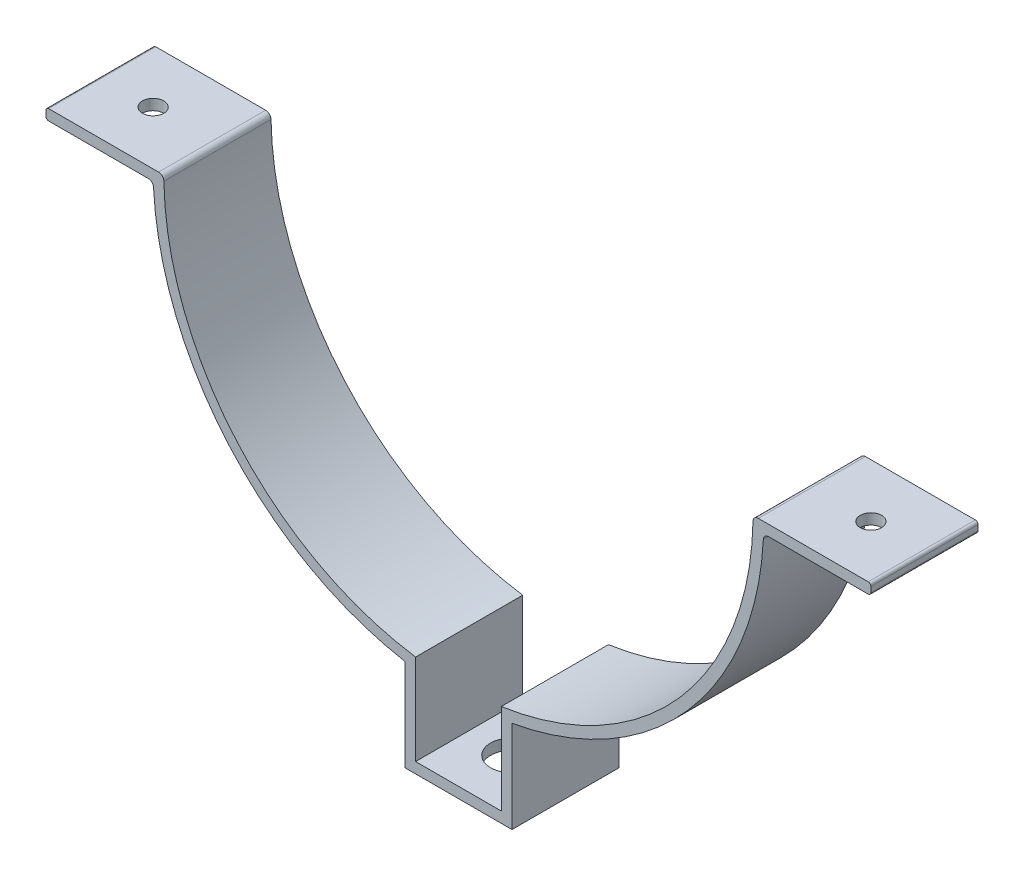
ISO-10303-21;
HEADER;
FILE_DESCRIPTION(('STEP AP214'),'2;1');
FILE_NAME('part.step','',(''),(''),'','','');
FILE_SCHEMA(('AUTOMOTIVE_DESIGN { 1 0 10303 214 1 1 1 1 }'));
ENDSEC;
DATA;
#1=APPLICATION_CONTEXT('core data for automotive mechanical design processes');
#2=APPLICATION_PROTOCOL_DEFINITION('international standard','automotive_design',2000,#1);
#3=PRODUCT_CONTEXT('',#1,'mechanical');
#4=PRODUCT('Part','Part','',(#3));
#5=PRODUCT_RELATED_PRODUCT_CATEGORY('part','',(#4));
#6=PRODUCT_DEFINITION_FORMATION('','',#4);
#7=PRODUCT_DEFINITION_CONTEXT('part definition',#1,'design');
#8=PRODUCT_DEFINITION('design','',#6,#7);
#9=PRODUCT_DEFINITION_SHAPE('','',#8);
#10=(LENGTH_UNIT() NAMED_UNIT(*) SI_UNIT(.MILLI.,.METRE.));
#11=(NAMED_UNIT(*) PLANE_ANGLE_UNIT() SI_UNIT($,.RADIAN.));
#12=(NAMED_UNIT(*) SI_UNIT($,.STERADIAN.) SOLID_ANGLE_UNIT());
#13=UNCERTAINTY_MEASURE_WITH_UNIT(LENGTH_MEASURE(1.E-05),#10,'distance_accuracy_value','');
#14=(GEOMETRIC_REPRESENTATION_CONTEXT(3) GLOBAL_UNCERTAINTY_ASSIGNED_CONTEXT((#13)) GLOBAL_UNIT_ASSIGNED_CONTEXT((#10,
#11,#12)) REPRESENTATION_CONTEXT('',''));
#15=CARTESIAN_POINT('',(0.,0.,0.));
#16=DIRECTION('',(0.,0.,1.));
#17=DIRECTION('',(1.,0.,0.));
#18=AXIS2_PLACEMENT_3D('',#15,#16,#17);
#19=CARTESIAN_POINT('',(-57.9223618302983,-3.,20.));
#20=DIRECTION('',(0.,0.,-1.));
#21=DIRECTION('',(-1.,0.,0.));
#22=AXIS2_PLACEMENT_3D('',#19,#20,#21);
#23=CYLINDRICAL_SURFACE('',#22,1.);
#24=CARTESIAN_POINT('',(-57.9223618302983,-3.,0.));
#25=DIRECTION('',(0.,0.,-1.));
#26=DIRECTION('',(1.,0.,0.));
#27=AXIS2_PLACEMENT_3D('',#24,#25,#26);
#28=CIRCLE('',#27,1.);
#29=CARTESIAN_POINT('',(-57.9223618302983,-2.,0.));
#30=VERTEX_POINT('',#29);
#31=CARTESIAN_POINT('',(-56.9237004194311,-2.94827586206897,0.));
#32=VERTEX_POINT('',#31);
#33=EDGE_CURVE('E227',#30,#32,#28,.T.);
#34=ORIENTED_EDGE('',*,*,#33,.T.);
#35=DIRECTION('',(0.,0.,-1.));
#36=VECTOR('',#35,1.);
#37=CARTESIAN_POINT('',(-56.9237004194311,-2.94827586206897,20.));
#38=LINE('',#37,#36);
#39=CARTESIAN_POINT('',(-56.9237004194311,-2.94827586206897,20.));
#40=VERTEX_POINT('',#39);
#41=EDGE_CURVE('E11',#40,#32,#38,.T.);
#42=ORIENTED_EDGE('',*,*,#41,.F.);
#43=CARTESIAN_POINT('',(-57.9223618302983,-3.,20.));
#44=DIRECTION('',(0.,0.,-1.));
#45=DIRECTION('',(1.,0.,0.));
#46=AXIS2_PLACEMENT_3D('',#43,#44,#45);
#47=CIRCLE('',#46,1.);
#48=CARTESIAN_POINT('',(-57.9223618302983,-2.,20.));
#49=VERTEX_POINT('',#48);
#50=EDGE_CURVE('E278',#49,#40,#47,.T.);
#51=ORIENTED_EDGE('',*,*,#50,.F.);
#52=DIRECTION('',(0.,0.,-1.));
#53=VECTOR('',#52,1.);
#54=CARTESIAN_POINT('',(-57.9223618302983,-2.,20.));
#55=LINE('',#54,#53);
#56=EDGE_CURVE('E223',#49,#30,#55,.T.);
#57=ORIENTED_EDGE('',*,*,#56,.T.);
#58=EDGE_LOOP('',(#34,#42,#51,#57));
#59=FACE_BOUND('',#58,.T.);
#60=ADVANCED_FACE('F33',(#59),#23,.F.);
#61=CARTESIAN_POINT('',(0.,0.,20.));
#62=DIRECTION('',(0.,0.,-1.));
#63=DIRECTION('',(-1.,0.,0.));
#64=AXIS2_PLACEMENT_3D('',#61,#62,#63);
#65=CYLINDRICAL_SURFACE('',#64,57.);
#66=CARTESIAN_POINT('',(0.,0.,0.));
#67=DIRECTION('',(0.,0.,1.));
#68=DIRECTION('',(1.,0.,0.));
#69=AXIS2_PLACEMENT_3D('',#66,#67,#68);
#70=CIRCLE('',#69,57.);
#71=CARTESIAN_POINT('',(-10.,-56.1159513863928,0.));
#72=VERTEX_POINT('',#71);
#73=EDGE_CURVE('E230',#32,#72,#70,.T.);
#74=ORIENTED_EDGE('',*,*,#73,.T.);
#75=DIRECTION('',(0.,0.,-1.));
#76=VECTOR('',#75,1.);
#77=CARTESIAN_POINT('',(-10.,-56.1159513863928,20.));
#78=LINE('',#77,#76);
#79=CARTESIAN_POINT('',(-10.,-56.1159513863928,20.));
#80=VERTEX_POINT('',#79);
#81=EDGE_CURVE('E42',#80,#72,#78,.T.);
#82=ORIENTED_EDGE('',*,*,#81,.F.);
#83=CARTESIAN_POINT('',(0.,0.,20.));
#84=DIRECTION('',(0.,0.,1.));
#85=DIRECTION('',(1.,0.,0.));
#86=AXIS2_PLACEMENT_3D('',#83,#84,#85);
#87=CIRCLE('',#86,57.);
#88=EDGE_CURVE('E142',#40,#80,#87,.T.);
#89=ORIENTED_EDGE('',*,*,#88,.F.);
#90=ORIENTED_EDGE('',*,*,#41,.T.);
#91=EDGE_LOOP('',(#74,#82,#89,#90));
#92=FACE_BOUND('',#91,.T.);
#93=ADVANCED_FACE('F422',(#92),#65,.T.);
#94=CARTESIAN_POINT('',(-10.,-73.3128558385895,20.));
#95=DIRECTION('',(1.,0.,0.));
#96=DIRECTION('',(0.,1.,0.));
#97=AXIS2_PLACEMENT_3D('',#94,#95,#96);
#98=PLANE('',#97);
#99=DIRECTION('',(0.,-1.,0.));
#100=VECTOR('',#99,1.);
#101=CARTESIAN_POINT('',(-10.,-73.3128558385895,0.));
#102=LINE('',#101,#100);
#103=CARTESIAN_POINT('',(-10.,-73.3128558385895,0.));
#104=VERTEX_POINT('',#103);
#105=EDGE_CURVE('E233',#72,#104,#102,.T.);
#106=ORIENTED_EDGE('',*,*,#105,.T.);
#107=DIRECTION('',(0.,0.,-1.));
#108=VECTOR('',#107,1.);
#109=CARTESIAN_POINT('',(-10.,-73.3128558385895,20.));
#110=LINE('',#109,#108);
#111=CARTESIAN_POINT('',(-10.,-73.3128558385895,20.));
#112=VERTEX_POINT('',#111);
#113=EDGE_CURVE('E333',#112,#104,#110,.T.);
#114=ORIENTED_EDGE('',*,*,#113,.F.);
#115=DIRECTION('',(0.,-1.,0.));
#116=VECTOR('',#115,1.);
#117=CARTESIAN_POINT('',(-10.,-73.3128558385895,20.));
#118=LINE('',#117,#116);
#119=EDGE_CURVE('E358',#80,#112,#118,.T.);
#120=ORIENTED_EDGE('',*,*,#119,.F.);
#121=ORIENTED_EDGE('',*,*,#81,.T.);
#122=EDGE_LOOP('',(#106,#114,#120,#121));
#123=FACE_BOUND('',#122,.T.);
#124=ADVANCED_FACE('F426',(#123),#98,.F.);
#125=CARTESIAN_POINT('',(-10.,-73.3128558385895,20.));
#126=DIRECTION('',(0.,1.,0.));
#127=DIRECTION('',(0.,0.,1.));
#128=AXIS2_PLACEMENT_3D('',#125,#126,#127);
#129=PLANE('',#128);
#130=CARTESIAN_POINT('',(0.,-73.3128558385895,10.));
#131=DIRECTION('',(0.,1.,0.));
#132=DIRECTION('',(0.,0.,1.));
#133=AXIS2_PLACEMENT_3D('',#130,#131,#132);
#134=CIRCLE('',#133,4.);
#135=CARTESIAN_POINT('',(0.,-73.3128558385895,14.));
#136=VERTEX_POINT('',#135);
#137=EDGE_CURVE('E231',#136,#136,#134,.T.);
#138=ORIENTED_EDGE('',*,*,#137,.T.);
#139=EDGE_LOOP('',(#138));
#140=FACE_BOUND('',#139,.T.);
#141=DIRECTION('',(1.,0.,0.));
#142=VECTOR('',#141,1.);
#143=CARTESIAN_POINT('',(-10.,-73.3128558385895,0.));
#144=LINE('',#143,#142);
#145=CARTESIAN_POINT('',(10.,-73.3128558385895,0.));
#146=VERTEX_POINT('',#145);
#147=EDGE_CURVE('E235',#104,#146,#144,.T.);
#148=ORIENTED_EDGE('',*,*,#147,.T.);
#149=DIRECTION('',(0.,0.,-1.));
#150=VECTOR('',#149,1.);
#151=CARTESIAN_POINT('',(10.,-73.3128558385895,20.));
#152=LINE('',#151,#150);
#153=CARTESIAN_POINT('',(10.,-73.3128558385895,20.));
#154=VERTEX_POINT('',#153);
#155=EDGE_CURVE('E330',#154,#146,#152,.T.);
#156=ORIENTED_EDGE('',*,*,#155,.F.);
#157=DIRECTION('',(1.,0.,0.));
#158=VECTOR('',#157,1.);
#159=CARTESIAN_POINT('',(-10.,-73.3128558385895,20.));
#160=LINE('',#159,#158);
#161=EDGE_CURVE('E360',#112,#154,#160,.T.);
#162=ORIENTED_EDGE('',*,*,#161,.F.);
#163=ORIENTED_EDGE('',*,*,#113,.T.);
#164=EDGE_LOOP('',(#148,#156,#162,#163));
#165=FACE_BOUND('',#164,.T.);
#166=ADVANCED_FACE('F430',(#140,#165),#129,.F.);
#167=CARTESIAN_POINT('',(10.,-73.3128558385895,20.));
#168=DIRECTION('',(-1.,0.,0.));
#169=DIRECTION('',(0.,-1.,0.));
#170=AXIS2_PLACEMENT_3D('',#167,#168,#169);
#171=PLANE('',#170);
#172=DIRECTION('',(0.,1.,0.));
#173=VECTOR('',#172,1.);
#174=CARTESIAN_POINT('',(10.,-73.3128558385895,0.));
#175=LINE('',#174,#173);
#176=CARTESIAN_POINT('',(10.,-56.1159513863928,0.));
#177=VERTEX_POINT('',#176);
#178=EDGE_CURVE('E237',#146,#177,#175,.T.);
#179=ORIENTED_EDGE('',*,*,#178,.T.);
#180=DIRECTION('',(0.,0.,-1.));
#181=VECTOR('',#180,1.);
#182=CARTESIAN_POINT('',(10.,-56.1159513863928,20.));
#183=LINE('',#182,#181);
#184=CARTESIAN_POINT('',(10.,-56.1159513863928,20.));
#185=VERTEX_POINT('',#184);
#186=EDGE_CURVE('E327',#185,#177,#183,.T.);
#187=ORIENTED_EDGE('',*,*,#186,.F.);
#188=DIRECTION('',(0.,1.,0.));
#189=VECTOR('',#188,1.);
#190=CARTESIAN_POINT('',(10.,-73.3128558385895,20.));
#191=LINE('',#190,#189);
#192=EDGE_CURVE('E362',#154,#185,#191,.T.);
#193=ORIENTED_EDGE('',*,*,#192,.F.);
#194=ORIENTED_EDGE('',*,*,#155,.T.);
#195=EDGE_LOOP('',(#179,#187,#193,#194));
#196=FACE_BOUND('',#195,.T.);
#197=ADVANCED_FACE('F436',(#196),#171,.F.);
#198=CARTESIAN_POINT('',(0.,0.,20.));
#199=DIRECTION('',(0.,0.,-1.));
#200=DIRECTION('',(-1.,0.,0.));
#201=AXIS2_PLACEMENT_3D('',#198,#199,#200);
#202=CYLINDRICAL_SURFACE('',#201,57.);
#203=CARTESIAN_POINT('',(0.,0.,0.));
#204=DIRECTION('',(0.,0.,1.));
#205=DIRECTION('',(1.,0.,0.));
#206=AXIS2_PLACEMENT_3D('',#203,#204,#205);
#207=CIRCLE('',#206,57.);
#208=CARTESIAN_POINT('',(56.9237004194311,-2.94827586206896,0.));
#209=VERTEX_POINT('',#208);
#210=EDGE_CURVE('E239',#177,#209,#207,.T.);
#211=ORIENTED_EDGE('',*,*,#210,.T.);
#212=DIRECTION('',(0.,0.,-1.));
#213=VECTOR('',#212,1.);
#214=CARTESIAN_POINT('',(56.9237004194311,-2.94827586206896,20.));
#215=LINE('',#214,#213);
#216=CARTESIAN_POINT('',(56.9237004194311,-2.94827586206896,20.));
#217=VERTEX_POINT('',#216);
#218=EDGE_CURVE('E324',#217,#209,#215,.T.);
#219=ORIENTED_EDGE('',*,*,#218,.F.);
#220=CARTESIAN_POINT('',(0.,0.,20.));
#221=DIRECTION('',(0.,0.,1.));
#222=DIRECTION('',(1.,0.,0.));
#223=AXIS2_PLACEMENT_3D('',#220,#221,#222);
#224=CIRCLE('',#223,57.);
#225=EDGE_CURVE('E364',#185,#217,#224,.T.);
#226=ORIENTED_EDGE('',*,*,#225,.F.);
#227=ORIENTED_EDGE('',*,*,#186,.T.);
#228=EDGE_LOOP('',(#211,#219,#226,#227));
#229=FACE_BOUND('',#228,.T.);
#230=ADVANCED_FACE('F440',(#229),#202,.T.);
#231=CARTESIAN_POINT('',(57.9223618302983,-3.,20.));
#232=DIRECTION('',(0.,0.,-1.));
#233=DIRECTION('',(-1.,0.,0.));
#234=AXIS2_PLACEMENT_3D('',#231,#232,#233);
#235=CYLINDRICAL_SURFACE('',#234,1.);
#236=CARTESIAN_POINT('',(57.9223618302983,-3.,0.));
#237=DIRECTION('',(0.,0.,-1.));
#238=DIRECTION('',(-1.,0.,0.));
#239=AXIS2_PLACEMENT_3D('',#236,#237,#238);
#240=CIRCLE('',#239,1.);
#241=CARTESIAN_POINT('',(57.9223618302983,-2.,0.));
#242=VERTEX_POINT('',#241);
#243=EDGE_CURVE('E241',#209,#242,#240,.T.);
#244=ORIENTED_EDGE('',*,*,#243,.T.);
#245=DIRECTION('',(0.,0.,-1.));
#246=VECTOR('',#245,1.);
#247=CARTESIAN_POINT('',(57.9223618302983,-2.,20.));
#248=LINE('',#247,#246);
#249=CARTESIAN_POINT('',(57.9223618302983,-2.,20.));
#250=VERTEX_POINT('',#249);
#251=EDGE_CURVE('E321',#250,#242,#248,.T.);
#252=ORIENTED_EDGE('',*,*,#251,.F.);
#253=CARTESIAN_POINT('',(57.9223618302983,-3.,20.));
#254=DIRECTION('',(0.,0.,-1.));
#255=DIRECTION('',(-1.,0.,0.));
#256=AXIS2_PLACEMENT_3D('',#253,#254,#255);
#257=CIRCLE('',#256,1.);
#258=EDGE_CURVE('E366',#217,#250,#257,.T.);
#259=ORIENTED_EDGE('',*,*,#258,.F.);
#260=ORIENTED_EDGE('',*,*,#218,.T.);
#261=EDGE_LOOP('',(#244,#252,#259,#260));
#262=FACE_BOUND('',#261,.T.);
#263=ADVANCED_FACE('F444',(#262),#235,.F.);
#264=CARTESIAN_POINT('',(76.5,-2.,20.));
#265=DIRECTION('',(0.,1.,0.));
#266=DIRECTION('',(0.,0.,1.));
#267=AXIS2_PLACEMENT_3D('',#264,#265,#266);
#268=PLANE('',#267);
#269=CARTESIAN_POINT('',(66.9999999999997,-2.,10.));
#270=DIRECTION('',(0.,1.,0.));
#271=DIRECTION('',(0.,0.,1.));
#272=AXIS2_PLACEMENT_3D('',#269,#270,#271);
#273=CIRCLE('',#272,2.);
#274=CARTESIAN_POINT('',(66.9999999999997,-2.,12.));
#275=VERTEX_POINT('',#274);
#276=EDGE_CURVE('E340',#275,#275,#273,.T.);
#277=ORIENTED_EDGE('',*,*,#276,.T.);
#278=EDGE_LOOP('',(#277));
#279=FACE_BOUND('',#278,.T.);
#280=DIRECTION('',(1.,0.,0.));
#281=VECTOR('',#280,1.);
#282=CARTESIAN_POINT('',(76.5,-2.,0.));
#283=LINE('',#282,#281);
#284=CARTESIAN_POINT('',(76.5,-2.,0.));
#285=VERTEX_POINT('',#284);
#286=EDGE_CURVE('E243',#242,#285,#283,.T.);
#287=ORIENTED_EDGE('',*,*,#286,.T.);
#288=DIRECTION('',(0.,0.,-1.));
#289=VECTOR('',#288,1.);
#290=CARTESIAN_POINT('',(76.5,-2.,20.));
#291=LINE('',#290,#289);
#292=CARTESIAN_POINT('',(76.5,-2.,20.));
#293=VERTEX_POINT('',#292);
#294=EDGE_CURVE('E318',#293,#285,#291,.T.);
#295=ORIENTED_EDGE('',*,*,#294,.F.);
#296=DIRECTION('',(1.,0.,0.));
#297=VECTOR('',#296,1.);
#298=CARTESIAN_POINT('',(76.5,-2.,20.));
#299=LINE('',#298,#297);
#300=EDGE_CURVE('E368',#250,#293,#299,.T.);
#301=ORIENTED_EDGE('',*,*,#300,.F.);
#302=ORIENTED_EDGE('',*,*,#251,.T.);
#303=EDGE_LOOP('',(#287,#295,#301,#302));
#304=FACE_BOUND('',#303,.T.);
#305=ADVANCED_FACE('F448',(#279,#304),#268,.F.);
#306=CARTESIAN_POINT('',(76.5,-1.5,20.));
#307=DIRECTION('',(0.,0.,-1.));
#308=DIRECTION('',(-1.,0.,0.));
#309=AXIS2_PLACEMENT_3D('',#306,#307,#308);
#310=CYLINDRICAL_SURFACE('',#309,0.5);
#311=CARTESIAN_POINT('',(76.5,-1.5,0.));
#312=DIRECTION('',(0.,0.,1.));
#313=DIRECTION('',(-1.,0.,0.));
#314=AXIS2_PLACEMENT_3D('',#311,#312,#313);
#315=CIRCLE('',#314,0.5);
#316=CARTESIAN_POINT('',(77.,-1.5,0.));
#317=VERTEX_POINT('',#316);
#318=EDGE_CURVE('E245',#285,#317,#315,.T.);
#319=ORIENTED_EDGE('',*,*,#318,.T.);
#320=DIRECTION('',(0.,0.,-1.));
#321=VECTOR('',#320,1.);
#322=CARTESIAN_POINT('',(77.,-1.5,20.));
#323=LINE('',#322,#321);
#324=CARTESIAN_POINT('',(77.,-1.5,20.));
#325=VERTEX_POINT('',#324);
#326=EDGE_CURVE('E315',#325,#317,#323,.T.);
#327=ORIENTED_EDGE('',*,*,#326,.F.);
#328=CARTESIAN_POINT('',(76.5,-1.5,20.));
#329=DIRECTION('',(0.,0.,1.));
#330=DIRECTION('',(-1.,0.,0.));
#331=AXIS2_PLACEMENT_3D('',#328,#329,#330);
#332=CIRCLE('',#331,0.5);
#333=EDGE_CURVE('E370',#293,#325,#332,.T.);
#334=ORIENTED_EDGE('',*,*,#333,.F.);
#335=ORIENTED_EDGE('',*,*,#294,.T.);
#336=EDGE_LOOP('',(#319,#327,#334,#335));
#337=FACE_BOUND('',#336,.T.);
#338=ADVANCED_FACE('F452',(#337),#310,.T.);
#339=CARTESIAN_POINT('',(77.,-0.500000000000018,20.));
#340=DIRECTION('',(-1.,0.,0.));
#341=DIRECTION('',(0.,-1.,0.));
#342=AXIS2_PLACEMENT_3D('',#339,#340,#341);
#343=PLANE('',#342);
#344=DIRECTION('',(0.,1.,0.));
#345=VECTOR('',#344,1.);
#346=CARTESIAN_POINT('',(77.,-0.500000000000018,0.));
#347=LINE('',#346,#345);
#348=CARTESIAN_POINT('',(77.,-0.500000000000018,0.));
#349=VERTEX_POINT('',#348);
#350=EDGE_CURVE('E247',#317,#349,#347,.T.);
#351=ORIENTED_EDGE('',*,*,#350,.T.);
#352=DIRECTION('',(0.,0.,-1.));
#353=VECTOR('',#352,1.);
#354=CARTESIAN_POINT('',(77.,-0.500000000000018,20.));
#355=LINE('',#354,#353);
#356=CARTESIAN_POINT('',(77.,-0.500000000000018,20.));
#357=VERTEX_POINT('',#356);
#358=EDGE_CURVE('E312',#357,#349,#355,.T.);
#359=ORIENTED_EDGE('',*,*,#358,.F.);
#360=DIRECTION('',(0.,1.,0.));
#361=VECTOR('',#360,1.);
#362=CARTESIAN_POINT('',(77.,-0.500000000000018,20.));
#363=LINE('',#362,#361);
#364=EDGE_CURVE('E372',#325,#357,#363,.T.);
#365=ORIENTED_EDGE('',*,*,#364,.F.);
#366=ORIENTED_EDGE('',*,*,#326,.T.);
#367=EDGE_LOOP('',(#351,#359,#365,#366));
#368=FACE_BOUND('',#367,.T.);
#369=ADVANCED_FACE('F456',(#368),#343,.F.);
#370=CARTESIAN_POINT('',(76.5,-0.500000000000011,20.));
#371=DIRECTION('',(0.,0.,-1.));
#372=DIRECTION('',(-1.,0.,0.));
#373=AXIS2_PLACEMENT_3D('',#370,#371,#372);
#374=CYLINDRICAL_SURFACE('',#373,0.5);
#375=CARTESIAN_POINT('',(76.5,-0.500000000000011,0.));
#376=DIRECTION('',(0.,0.,1.));
#377=DIRECTION('',(1.,0.,0.));
#378=AXIS2_PLACEMENT_3D('',#375,#376,#377);
#379=CIRCLE('',#378,0.5);
#380=CARTESIAN_POINT('',(76.5,0.,0.));
#381=VERTEX_POINT('',#380);
#382=EDGE_CURVE('E249',#349,#381,#379,.T.);
#383=ORIENTED_EDGE('',*,*,#382,.T.);
#384=DIRECTION('',(0.,0.,-1.));
#385=VECTOR('',#384,1.);
#386=CARTESIAN_POINT('',(76.5,0.,20.));
#387=LINE('',#386,#385);
#388=CARTESIAN_POINT('',(76.5,0.,20.));
#389=VERTEX_POINT('',#388);
#390=EDGE_CURVE('E309',#389,#381,#387,.T.);
#391=ORIENTED_EDGE('',*,*,#390,.F.);
#392=CARTESIAN_POINT('',(76.5,-0.500000000000011,20.));
#393=DIRECTION('',(0.,0.,1.));
#394=DIRECTION('',(1.,0.,0.));
#395=AXIS2_PLACEMENT_3D('',#392,#393,#394);
#396=CIRCLE('',#395,0.5);
#397=EDGE_CURVE('E374',#357,#389,#396,.T.);
#398=ORIENTED_EDGE('',*,*,#397,.F.);
#399=ORIENTED_EDGE('',*,*,#358,.T.);
#400=EDGE_LOOP('',(#383,#391,#398,#399));
#401=FACE_BOUND('',#400,.T.);
#402=ADVANCED_FACE('F460',(#401),#374,.T.);
#403=CARTESIAN_POINT('',(57.,-3.59018503583753E-13,20.));
#404=DIRECTION('',(-1.79509251791877E-13,-1.,0.));
#405=DIRECTION('',(1.,-1.79509251791877E-13,0.));
#406=AXIS2_PLACEMENT_3D('',#403,#404,#405);
#407=PLANE('',#406);
#408=CARTESIAN_POINT('',(67.0000000000001,-2.15105711021124E-12,10.));
#409=DIRECTION('',(-1.79509251791877E-13,-1.,0.));
#410=DIRECTION('',(1.,-1.79509251791877E-13,0.));
#411=AXIS2_PLACEMENT_3D('',#408,#409,#410);
#412=CIRCLE('',#411,2.);
#413=CARTESIAN_POINT('',(69.0000000000001,-2.51007561379499E-12,10.));
#414=VERTEX_POINT('',#413);
#415=EDGE_CURVE('E341',#414,#414,#412,.T.);
#416=ORIENTED_EDGE('',*,*,#415,.T.);
#417=EDGE_LOOP('',(#416));
#418=FACE_BOUND('',#417,.T.);
#419=DIRECTION('',(-1.,1.79509251791877E-13,0.));
#420=VECTOR('',#419,1.);
#421=CARTESIAN_POINT('',(57.,-3.59018503583753E-13,0.));
#422=LINE('',#421,#420);
#423=CARTESIAN_POINT('',(55.9910707166779,-1.77906362823681E-13,0.));
#424=VERTEX_POINT('',#423);
#425=EDGE_CURVE('E252',#381,#424,#422,.T.);
#426=ORIENTED_EDGE('',*,*,#425,.T.);
#427=DIRECTION('',(0.,0.,-1.));
#428=VECTOR('',#427,1.);
#429=CARTESIAN_POINT('',(55.9910707166779,-1.77906362823681E-13,20.));
#430=LINE('',#429,#428);
#431=CARTESIAN_POINT('',(55.9910707166779,-1.77906362823681E-13,20.));
#432=VERTEX_POINT('',#431);
#433=EDGE_CURVE('E306',#432,#424,#430,.T.);
#434=ORIENTED_EDGE('',*,*,#433,.F.);
#435=DIRECTION('',(-1.,0.,0.));
#436=VECTOR('',#435,1.);
#437=CARTESIAN_POINT('',(57.,-3.59018503583753E-13,20.));
#438=LINE('',#437,#436);
#439=EDGE_CURVE('E376',#389,#432,#438,.T.);
#440=ORIENTED_EDGE('',*,*,#439,.F.);
#441=ORIENTED_EDGE('',*,*,#390,.T.);
#442=EDGE_LOOP('',(#426,#434,#440,#441));
#443=FACE_BOUND('',#442,.T.);
#444=ADVANCED_FACE('F464',(#418,#443),#407,.F.);
#445=CARTESIAN_POINT('',(55.9910707166777,-1.00000000000018,20.));
#446=DIRECTION('',(0.,0.,-1.));
#447=DIRECTION('',(-1.,0.,0.));
#448=AXIS2_PLACEMENT_3D('',#445,#446,#447);
#449=CYLINDRICAL_SURFACE('',#448,0.999999999999999);
#450=CARTESIAN_POINT('',(55.9910707166777,-1.00000000000018,0.));
#451=DIRECTION('',(0.,0.,1.));
#452=DIRECTION('',(-1.,0.,0.));
#453=AXIS2_PLACEMENT_3D('',#450,#451,#452);
#454=CIRCLE('',#453,0.999999999999999);
#455=CARTESIAN_POINT('',(54.9912301681656,-0.982142857143032,0.));
#456=VERTEX_POINT('',#455);
#457=EDGE_CURVE('E254',#424,#456,#454,.T.);
#458=ORIENTED_EDGE('',*,*,#457,.T.);
#459=DIRECTION('',(0.,0.,-1.));
#460=VECTOR('',#459,1.);
#461=CARTESIAN_POINT('',(54.9912301681656,-0.982142857143032,20.));
#462=LINE('',#461,#460);
#463=CARTESIAN_POINT('',(54.9912301681656,-0.982142857143032,20.));
#464=VERTEX_POINT('',#463);
#465=EDGE_CURVE('E303',#464,#456,#462,.T.);
#466=ORIENTED_EDGE('',*,*,#465,.F.);
#467=CARTESIAN_POINT('',(55.9910707166777,-1.00000000000018,20.));
#468=DIRECTION('',(0.,0.,1.));
#469=DIRECTION('',(-1.,0.,0.));
#470=AXIS2_PLACEMENT_3D('',#467,#468,#469);
#471=CIRCLE('',#470,0.999999999999999);
#472=EDGE_CURVE('E378',#432,#464,#471,.T.);
#473=ORIENTED_EDGE('',*,*,#472,.F.);
#474=ORIENTED_EDGE('',*,*,#433,.T.);
#475=EDGE_LOOP('',(#458,#466,#473,#474));
#476=FACE_BOUND('',#475,.T.);
#477=ADVANCED_FACE('F468',(#476),#449,.T.);
#478=CARTESIAN_POINT('',(0.,0.,20.));
#479=DIRECTION('',(0.,0.,-1.));
#480=DIRECTION('',(-1.,0.,0.));
#481=AXIS2_PLACEMENT_3D('',#478,#479,#480);
#482=CYLINDRICAL_SURFACE('',#481,55.);
#483=CARTESIAN_POINT('',(0.,0.,0.));
#484=DIRECTION('',(0.,0.,-1.));
#485=DIRECTION('',(1.,0.,0.));
#486=AXIS2_PLACEMENT_3D('',#483,#484,#485);
#487=CIRCLE('',#486,55.);
#488=CARTESIAN_POINT('',(8.,-54.4150714416512,0.));
#489=VERTEX_POINT('',#488);
#490=EDGE_CURVE('E256',#456,#489,#487,.T.);
#491=ORIENTED_EDGE('',*,*,#490,.T.);
#492=DIRECTION('',(0.,0.,-1.));
#493=VECTOR('',#492,1.);
#494=CARTESIAN_POINT('',(8.,-54.4150714416512,20.));
#495=LINE('',#494,#493);
#496=CARTESIAN_POINT('',(8.,-54.4150714416512,20.));
#497=VERTEX_POINT('',#496);
#498=EDGE_CURVE('E300',#497,#489,#495,.T.);
#499=ORIENTED_EDGE('',*,*,#498,.F.);
#500=CARTESIAN_POINT('',(0.,0.,20.));
#501=DIRECTION('',(0.,0.,-1.));
#502=DIRECTION('',(1.,0.,0.));
#503=AXIS2_PLACEMENT_3D('',#500,#501,#502);
#504=CIRCLE('',#503,55.);
#505=EDGE_CURVE('E380',#464,#497,#504,.T.);
#506=ORIENTED_EDGE('',*,*,#505,.F.);
#507=ORIENTED_EDGE('',*,*,#465,.T.);
#508=EDGE_LOOP('',(#491,#499,#506,#507));
#509=FACE_BOUND('',#508,.T.);
#510=ADVANCED_FACE('F471',(#509),#482,.F.);
#511=CARTESIAN_POINT('',(8.00000000000001,-56.4358042380899,20.));
#512=DIRECTION('',(1.,0.,0.));
#513=DIRECTION('',(0.,1.,0.));
#514=AXIS2_PLACEMENT_3D('',#511,#512,#513);
#515=PLANE('',#514);
#516=DIRECTION('',(0.,-1.,0.));
#517=VECTOR('',#516,1.);
#518=CARTESIAN_POINT('',(8.00000000000001,-56.4358042380899,0.));
#519=LINE('',#518,#517);
#520=CARTESIAN_POINT('',(8.,-71.3128558385895,0.));
#521=VERTEX_POINT('',#520);
#522=EDGE_CURVE('E259',#489,#521,#519,.T.);
#523=ORIENTED_EDGE('',*,*,#522,.T.);
#524=DIRECTION('',(0.,0.,-1.));
#525=VECTOR('',#524,1.);
#526=CARTESIAN_POINT('',(8.,-71.3128558385895,20.));
#527=LINE('',#526,#525);
#528=CARTESIAN_POINT('',(8.,-71.3128558385895,20.));
#529=VERTEX_POINT('',#528);
#530=EDGE_CURVE('E297',#529,#521,#527,.T.);
#531=ORIENTED_EDGE('',*,*,#530,.F.);
#532=DIRECTION('',(0.,-1.,0.));
#533=VECTOR('',#532,1.);
#534=CARTESIAN_POINT('',(8.00000000000001,-56.4358042380899,20.));
#535=LINE('',#534,#533);
#536=EDGE_CURVE('E382',#497,#529,#535,.T.);
#537=ORIENTED_EDGE('',*,*,#536,.F.);
#538=ORIENTED_EDGE('',*,*,#498,.T.);
#539=EDGE_LOOP('',(#523,#531,#537,#538));
#540=FACE_BOUND('',#539,.T.);
#541=ADVANCED_FACE('F475',(#540),#515,.F.);
#542=CARTESIAN_POINT('',(-8.,-71.3128558385895,20.));
#543=DIRECTION('',(0.,-1.,0.));
#544=DIRECTION('',(0.,0.,-1.));
#545=AXIS2_PLACEMENT_3D('',#542,#543,#544);
#546=PLANE('',#545);
#547=CARTESIAN_POINT('',(0.,-71.3128558385895,10.));
#548=DIRECTION('',(0.,-1.,0.));
#549=DIRECTION('',(0.,0.,-1.));
#550=AXIS2_PLACEMENT_3D('',#547,#548,#549);
#551=CIRCLE('',#550,4.);
#552=CARTESIAN_POINT('',(0.,-71.3128558385895,6.));
#553=VERTEX_POINT('',#552);
#554=EDGE_CURVE('E338',#553,#553,#551,.T.);
#555=ORIENTED_EDGE('',*,*,#554,.T.);
#556=EDGE_LOOP('',(#555));
#557=FACE_BOUND('',#556,.T.);
#558=DIRECTION('',(-1.,0.,0.));
#559=VECTOR('',#558,1.);
#560=CARTESIAN_POINT('',(-8.,-71.3128558385895,0.));
#561=LINE('',#560,#559);
#562=CARTESIAN_POINT('',(-8.,-71.3128558385895,0.));
#563=VERTEX_POINT('',#562);
#564=EDGE_CURVE('E261',#521,#563,#561,.T.);
#565=ORIENTED_EDGE('',*,*,#564,.T.);
#566=DIRECTION('',(0.,0.,-1.));
#567=VECTOR('',#566,1.);
#568=CARTESIAN_POINT('',(-8.,-71.3128558385895,20.));
#569=LINE('',#568,#567);
#570=CARTESIAN_POINT('',(-8.,-71.3128558385895,20.));
#571=VERTEX_POINT('',#570);
#572=EDGE_CURVE('E294',#571,#563,#569,.T.);
#573=ORIENTED_EDGE('',*,*,#572,.F.);
#574=DIRECTION('',(-1.,0.,0.));
#575=VECTOR('',#574,1.);
#576=CARTESIAN_POINT('',(-8.,-71.3128558385895,20.));
#577=LINE('',#576,#575);
#578=EDGE_CURVE('E384',#529,#571,#577,.T.);
#579=ORIENTED_EDGE('',*,*,#578,.F.);
#580=ORIENTED_EDGE('',*,*,#530,.T.);
#581=EDGE_LOOP('',(#565,#573,#579,#580));
#582=FACE_BOUND('',#581,.T.);
#583=ADVANCED_FACE('F479',(#557,#582),#546,.F.);
#584=CARTESIAN_POINT('',(-7.99999999999999,-56.4358042380899,20.));
#585=DIRECTION('',(-1.,0.,0.));
#586=DIRECTION('',(0.,0.,1.));
#587=AXIS2_PLACEMENT_3D('',#584,#585,#586);
#588=PLANE('',#587);
#589=DIRECTION('',(0.,1.,0.));
#590=VECTOR('',#589,1.);
#591=CARTESIAN_POINT('',(-7.99999999999999,-56.4358042380899,0.));
#592=LINE('',#591,#590);
#593=CARTESIAN_POINT('',(-7.99999999999999,-54.4150714416512,0.));
#594=VERTEX_POINT('',#593);
#595=EDGE_CURVE('E264',#563,#594,#592,.T.);
#596=ORIENTED_EDGE('',*,*,#595,.T.);
#597=DIRECTION('',(0.,0.,-1.));
#598=VECTOR('',#597,1.);
#599=CARTESIAN_POINT('',(-7.99999999999999,-54.4150714416512,20.));
#600=LINE('',#599,#598);
#601=CARTESIAN_POINT('',(-7.99999999999999,-54.4150714416512,20.));
#602=VERTEX_POINT('',#601);
#603=EDGE_CURVE('E291',#602,#594,#600,.T.);
#604=ORIENTED_EDGE('',*,*,#603,.F.);
#605=DIRECTION('',(0.,1.,0.));
#606=VECTOR('',#605,1.);
#607=CARTESIAN_POINT('',(-7.99999999999999,-56.4358042380899,20.));
#608=LINE('',#607,#606);
#609=EDGE_CURVE('E386',#571,#602,#608,.T.);
#610=ORIENTED_EDGE('',*,*,#609,.F.);
#611=ORIENTED_EDGE('',*,*,#572,.T.);
#612=EDGE_LOOP('',(#596,#604,#610,#611));
#613=FACE_BOUND('',#612,.T.);
#614=ADVANCED_FACE('F483',(#613),#588,.F.);
#615=CARTESIAN_POINT('',(0.,0.,20.));
#616=DIRECTION('',(0.,0.,-1.));
#617=DIRECTION('',(-1.,0.,0.));
#618=AXIS2_PLACEMENT_3D('',#615,#616,#617);
#619=CYLINDRICAL_SURFACE('',#618,55.);
#620=CARTESIAN_POINT('',(0.,0.,0.));
#621=DIRECTION('',(0.,0.,-1.));
#622=DIRECTION('',(1.,0.,0.));
#623=AXIS2_PLACEMENT_3D('',#620,#621,#622);
#624=CIRCLE('',#623,55.);
#625=CARTESIAN_POINT('',(-54.9912301681656,-0.982142857143017,0.));
#626=VERTEX_POINT('',#625);
#627=EDGE_CURVE('E266',#594,#626,#624,.T.);
#628=ORIENTED_EDGE('',*,*,#627,.T.);
#629=DIRECTION('',(0.,0.,-1.));
#630=VECTOR('',#629,1.);
#631=CARTESIAN_POINT('',(-54.9912301681656,-0.982142857143017,20.));
#632=LINE('',#631,#630);
#633=CARTESIAN_POINT('',(-54.9912301681656,-0.982142857143017,20.));
#634=VERTEX_POINT('',#633);
#635=EDGE_CURVE('E288',#634,#626,#632,.T.);
#636=ORIENTED_EDGE('',*,*,#635,.F.);
#637=CARTESIAN_POINT('',(0.,0.,20.));
#638=DIRECTION('',(0.,0.,-1.));
#639=DIRECTION('',(1.,0.,0.));
#640=AXIS2_PLACEMENT_3D('',#637,#638,#639);
#641=CIRCLE('',#640,55.);
#642=EDGE_CURVE('E388',#602,#634,#641,.T.);
#643=ORIENTED_EDGE('',*,*,#642,.F.);
#644=ORIENTED_EDGE('',*,*,#603,.T.);
#645=EDGE_LOOP('',(#628,#636,#643,#644));
#646=FACE_BOUND('',#645,.T.);
#647=ADVANCED_FACE('F487',(#646),#619,.F.);
#648=CARTESIAN_POINT('',(-55.9910707166777,-1.00000000000018,20.));
#649=DIRECTION('',(0.,0.,-1.));
#650=DIRECTION('',(-1.,0.,0.));
#651=AXIS2_PLACEMENT_3D('',#648,#649,#650);
#652=CYLINDRICAL_SURFACE('',#651,0.999999999999999);
#653=CARTESIAN_POINT('',(-55.9910707166777,-1.00000000000018,0.));
#654=DIRECTION('',(0.,0.,1.));
#655=DIRECTION('',(1.,0.,0.));
#656=AXIS2_PLACEMENT_3D('',#653,#654,#655);
#657=CIRCLE('',#656,0.999999999999999);
#658=CARTESIAN_POINT('',(-55.9910707166779,-1.79110198894605E-13,0.));
#659=VERTEX_POINT('',#658);
#660=EDGE_CURVE('E268',#626,#659,#657,.T.);
#661=ORIENTED_EDGE('',*,*,#660,.T.);
#662=DIRECTION('',(0.,0.,-1.));
#663=VECTOR('',#662,1.);
#664=CARTESIAN_POINT('',(-55.9910707166779,-1.79110198894605E-13,20.));
#665=LINE('',#664,#663);
#666=CARTESIAN_POINT('',(-55.9910707166779,-1.79110198894605E-13,20.));
#667=VERTEX_POINT('',#666);
#668=EDGE_CURVE('E285',#667,#659,#665,.T.);
#669=ORIENTED_EDGE('',*,*,#668,.F.);
#670=CARTESIAN_POINT('',(-55.9910707166777,-1.00000000000018,20.));
#671=DIRECTION('',(0.,0.,1.));
#672=DIRECTION('',(1.,0.,0.));
#673=AXIS2_PLACEMENT_3D('',#670,#671,#672);
#674=CIRCLE('',#673,0.999999999999999);
#675=EDGE_CURVE('E390',#634,#667,#674,.T.);
#676=ORIENTED_EDGE('',*,*,#675,.F.);
#677=ORIENTED_EDGE('',*,*,#635,.T.);
#678=EDGE_LOOP('',(#661,#669,#676,#677));
#679=FACE_BOUND('',#678,.T.);
#680=ADVANCED_FACE('F491',(#679),#652,.T.);
#681=CARTESIAN_POINT('',(-57.,-3.59018503583753E-13,20.));
#682=DIRECTION('',(0.,-1.,0.));
#683=DIRECTION('',(1.,0.,0.));
#684=AXIS2_PLACEMENT_3D('',#681,#682,#683);
#685=PLANE('',#684);
#686=CARTESIAN_POINT('',(-67.0000000000001,-1.80411241501588E-13,10.));
#687=DIRECTION('',(0.,-1.,0.));
#688=DIRECTION('',(1.,0.,0.));
#689=AXIS2_PLACEMENT_3D('',#686,#687,#688);
#690=CIRCLE('',#689,2.);
#691=CARTESIAN_POINT('',(-65.0000000000001,-2.16068162500134E-13,10.));
#692=VERTEX_POINT('',#691);
#693=EDGE_CURVE('E343',#692,#692,#690,.F.);
#694=ORIENTED_EDGE('',*,*,#693,.F.);
#695=EDGE_LOOP('',(#694));
#696=FACE_BOUND('',#695,.T.);
#697=DIRECTION('',(-1.,0.,0.));
#698=VECTOR('',#697,1.);
#699=CARTESIAN_POINT('',(-57.,-3.59018503583753E-13,0.));
#700=LINE('',#699,#698);
#701=CARTESIAN_POINT('',(-76.5,0.,0.));
#702=VERTEX_POINT('',#701);
#703=EDGE_CURVE('E271',#659,#702,#700,.T.);
#704=ORIENTED_EDGE('',*,*,#703,.T.);
#705=DIRECTION('',(0.,0.,-1.));
#706=VECTOR('',#705,1.);
#707=CARTESIAN_POINT('',(-76.5,0.,20.));
#708=LINE('',#707,#706);
#709=CARTESIAN_POINT('',(-76.5,0.,20.));
#710=VERTEX_POINT('',#709);
#711=EDGE_CURVE('E282',#710,#702,#708,.T.);
#712=ORIENTED_EDGE('',*,*,#711,.F.);
#713=DIRECTION('',(-1.,-1.79509251791877E-13,0.));
#714=VECTOR('',#713,1.);
#715=CARTESIAN_POINT('',(-57.,-3.59018503583753E-13,20.));
#716=LINE('',#715,#714);
#717=EDGE_CURVE('E392',#667,#710,#716,.T.);
#718=ORIENTED_EDGE('',*,*,#717,.F.);
#719=ORIENTED_EDGE('',*,*,#668,.T.);
#720=EDGE_LOOP('',(#704,#712,#718,#719));
#721=FACE_BOUND('',#720,.T.);
#722=ADVANCED_FACE('F398',(#696,#721),#685,.F.);
#723=CARTESIAN_POINT('',(-76.5,-0.500000000000011,20.));
#724=DIRECTION('',(0.,0.,-1.));
#725=DIRECTION('',(-1.,0.,0.));
#726=AXIS2_PLACEMENT_3D('',#723,#724,#725);
#727=CYLINDRICAL_SURFACE('',#726,0.5);
#728=CARTESIAN_POINT('',(-76.5,-0.500000000000011,0.));
#729=DIRECTION('',(0.,0.,1.));
#730=DIRECTION('',(-1.,0.,0.));
#731=AXIS2_PLACEMENT_3D('',#728,#729,#730);
#732=CIRCLE('',#731,0.5);
#733=CARTESIAN_POINT('',(-77.,-0.500000000000019,0.));
#734=VERTEX_POINT('',#733);
#735=EDGE_CURVE('E273',#702,#734,#732,.T.);
#736=ORIENTED_EDGE('',*,*,#735,.T.);
#737=DIRECTION('',(0.,0.,-1.));
#738=VECTOR('',#737,1.);
#739=CARTESIAN_POINT('',(-77.,-0.500000000000019,20.));
#740=LINE('',#739,#738);
#741=CARTESIAN_POINT('',(-77.,-0.500000000000019,20.));
#742=VERTEX_POINT('',#741);
#743=EDGE_CURVE('E218',#742,#734,#740,.T.);
#744=ORIENTED_EDGE('',*,*,#743,.F.);
#745=CARTESIAN_POINT('',(-76.5,-0.500000000000011,20.));
#746=DIRECTION('',(0.,0.,1.));
#747=DIRECTION('',(-1.,0.,0.));
#748=AXIS2_PLACEMENT_3D('',#745,#746,#747);
#749=CIRCLE('',#748,0.5);
#750=EDGE_CURVE('E209',#710,#742,#749,.T.);
#751=ORIENTED_EDGE('',*,*,#750,.F.);
#752=ORIENTED_EDGE('',*,*,#711,.T.);
#753=EDGE_LOOP('',(#736,#744,#751,#752));
#754=FACE_BOUND('',#753,.T.);
#755=ADVANCED_FACE('F401',(#754),#727,.T.);
#756=CARTESIAN_POINT('',(-77.,-0.500000000000018,20.));
#757=DIRECTION('',(1.,0.,0.));
#758=DIRECTION('',(0.,1.,0.));
#759=AXIS2_PLACEMENT_3D('',#756,#757,#758);
#760=PLANE('',#759);
#761=DIRECTION('',(0.,-1.,0.));
#762=VECTOR('',#761,1.);
#763=CARTESIAN_POINT('',(-77.,-0.500000000000018,0.));
#764=LINE('',#763,#762);
#765=CARTESIAN_POINT('',(-77.,-1.5,0.));
#766=VERTEX_POINT('',#765);
#767=EDGE_CURVE('E217',#734,#766,#764,.T.);
#768=ORIENTED_EDGE('',*,*,#767,.T.);
#769=DIRECTION('',(0.,0.,-1.));
#770=VECTOR('',#769,1.);
#771=CARTESIAN_POINT('',(-77.,-1.5,20.));
#772=LINE('',#771,#770);
#773=CARTESIAN_POINT('',(-77.,-1.5,20.));
#774=VERTEX_POINT('',#773);
#775=EDGE_CURVE('E214',#774,#766,#772,.T.);
#776=ORIENTED_EDGE('',*,*,#775,.F.);
#777=DIRECTION('',(0.,-1.,0.));
#778=VECTOR('',#777,1.);
#779=CARTESIAN_POINT('',(-77.,-0.500000000000018,20.));
#780=LINE('',#779,#778);
#781=EDGE_CURVE('E203',#742,#774,#780,.T.);
#782=ORIENTED_EDGE('',*,*,#781,.F.);
#783=ORIENTED_EDGE('',*,*,#743,.T.);
#784=EDGE_LOOP('',(#768,#776,#782,#783));
#785=FACE_BOUND('',#784,.T.);
#786=ADVANCED_FACE('F215',(#785),#760,.F.);
#787=CARTESIAN_POINT('',(-76.5,-1.5,20.));
#788=DIRECTION('',(0.,0.,-1.));
#789=DIRECTION('',(-1.,0.,0.));
#790=AXIS2_PLACEMENT_3D('',#787,#788,#789);
#791=CYLINDRICAL_SURFACE('',#790,0.5);
#792=CARTESIAN_POINT('',(-76.5,-1.5,0.));
#793=DIRECTION('',(0.,0.,1.));
#794=DIRECTION('',(1.,0.,0.));
#795=AXIS2_PLACEMENT_3D('',#792,#793,#794);
#796=CIRCLE('',#795,0.5);
#797=CARTESIAN_POINT('',(-76.5,-2.,0.));
#798=VERTEX_POINT('',#797);
#799=EDGE_CURVE('E128',#766,#798,#796,.T.);
#800=ORIENTED_EDGE('',*,*,#799,.T.);
#801=DIRECTION('',(0.,0.,-1.));
#802=VECTOR('',#801,1.);
#803=CARTESIAN_POINT('',(-76.5,-2.,20.));
#804=LINE('',#803,#802);
#805=CARTESIAN_POINT('',(-76.5,-2.,20.));
#806=VERTEX_POINT('',#805);
#807=EDGE_CURVE('E219',#806,#798,#804,.T.);
#808=ORIENTED_EDGE('',*,*,#807,.F.);
#809=CARTESIAN_POINT('',(-76.5,-1.5,20.));
#810=DIRECTION('',(0.,0.,1.));
#811=DIRECTION('',(1.,0.,0.));
#812=AXIS2_PLACEMENT_3D('',#809,#810,#811);
#813=CIRCLE('',#812,0.5);
#814=EDGE_CURVE('E207',#774,#806,#813,.T.);
#815=ORIENTED_EDGE('',*,*,#814,.F.);
#816=ORIENTED_EDGE('',*,*,#775,.T.);
#817=EDGE_LOOP('',(#800,#808,#815,#816));
#818=FACE_BOUND('',#817,.T.);
#819=ADVANCED_FACE('F221',(#818),#791,.T.);
#820=CARTESIAN_POINT('',(-76.5,-2.,20.));
#821=DIRECTION('',(0.,1.,0.));
#822=DIRECTION('',(0.,0.,1.));
#823=AXIS2_PLACEMENT_3D('',#820,#821,#822);
#824=PLANE('',#823);
#825=CARTESIAN_POINT('',(-66.9999999999997,-2.,10.));
#826=DIRECTION('',(0.,1.,0.));
#827=DIRECTION('',(0.,0.,1.));
#828=AXIS2_PLACEMENT_3D('',#825,#826,#827);
#829=CIRCLE('',#828,2.);
#830=CARTESIAN_POINT('',(-66.9999999999997,-2.,12.));
#831=VERTEX_POINT('',#830);
#832=EDGE_CURVE('E36',#831,#831,#829,.F.);
#833=ORIENTED_EDGE('',*,*,#832,.F.);
#834=EDGE_LOOP('',(#833));
#835=FACE_BOUND('',#834,.T.);
#836=DIRECTION('',(1.,0.,0.));
#837=VECTOR('',#836,1.);
#838=CARTESIAN_POINT('',(-76.5,-2.,0.));
#839=LINE('',#838,#837);
#840=EDGE_CURVE('E134',#798,#30,#839,.T.);
#841=ORIENTED_EDGE('',*,*,#840,.T.);
#842=ORIENTED_EDGE('',*,*,#56,.F.);
#843=DIRECTION('',(1.,0.,0.));
#844=VECTOR('',#843,1.);
#845=CARTESIAN_POINT('',(-76.5,-2.,20.));
#846=LINE('',#845,#844);
#847=EDGE_CURVE('E51',#806,#49,#846,.T.);
#848=ORIENTED_EDGE('',*,*,#847,.F.);
#849=ORIENTED_EDGE('',*,*,#807,.T.);
#850=EDGE_LOOP('',(#841,#842,#848,#849));
#851=FACE_BOUND('',#850,.T.);
#852=ADVANCED_FACE('F409',(#835,#851),#824,.F.);
#853=CARTESIAN_POINT('',(-57.9223618302983,-3.,20.));
#854=DIRECTION('',(0.,0.,1.));
#855=DIRECTION('',(1.,0.,0.));
#856=AXIS2_PLACEMENT_3D('',#853,#854,#855);
#857=PLANE('',#856);
#858=ORIENTED_EDGE('',*,*,#50,.T.);
#859=ORIENTED_EDGE('',*,*,#88,.T.);
#860=ORIENTED_EDGE('',*,*,#119,.T.);
#861=ORIENTED_EDGE('',*,*,#161,.T.);
#862=ORIENTED_EDGE('',*,*,#192,.T.);
#863=ORIENTED_EDGE('',*,*,#225,.T.);
#864=ORIENTED_EDGE('',*,*,#258,.T.);
#865=ORIENTED_EDGE('',*,*,#300,.T.);
#866=ORIENTED_EDGE('',*,*,#333,.T.);
#867=ORIENTED_EDGE('',*,*,#364,.T.);
#868=ORIENTED_EDGE('',*,*,#397,.T.);
#869=ORIENTED_EDGE('',*,*,#439,.T.);
#870=ORIENTED_EDGE('',*,*,#472,.T.);
#871=ORIENTED_EDGE('',*,*,#505,.T.);
#872=ORIENTED_EDGE('',*,*,#536,.T.);
#873=ORIENTED_EDGE('',*,*,#578,.T.);
#874=ORIENTED_EDGE('',*,*,#609,.T.);
#875=ORIENTED_EDGE('',*,*,#642,.T.);
#876=ORIENTED_EDGE('',*,*,#675,.T.);
#877=ORIENTED_EDGE('',*,*,#717,.T.);
#878=ORIENTED_EDGE('',*,*,#750,.T.);
#879=ORIENTED_EDGE('',*,*,#781,.T.);
#880=ORIENTED_EDGE('',*,*,#814,.T.);
#881=ORIENTED_EDGE('',*,*,#847,.T.);
#882=EDGE_LOOP('',(#858,#859,#860,#861,#862,#863,#864,#865,#866,#867,#868,#869,#870,#871,#872,
#873,#874,#875,#876,#877,#878,#879,#880,#881));
#883=FACE_BOUND('',#882,.T.);
#884=ADVANCED_FACE('F205',(#883),#857,.T.);
#885=CARTESIAN_POINT('',(-57.9223618302983,-3.,0.));
#886=DIRECTION('',(0.,0.,1.));
#887=DIRECTION('',(1.,0.,0.));
#888=AXIS2_PLACEMENT_3D('',#885,#886,#887);
#889=PLANE('',#888);
#890=ORIENTED_EDGE('',*,*,#33,.F.);
#891=ORIENTED_EDGE('',*,*,#840,.F.);
#892=ORIENTED_EDGE('',*,*,#799,.F.);
#893=ORIENTED_EDGE('',*,*,#767,.F.);
#894=ORIENTED_EDGE('',*,*,#735,.F.);
#895=ORIENTED_EDGE('',*,*,#703,.F.);
#896=ORIENTED_EDGE('',*,*,#660,.F.);
#897=ORIENTED_EDGE('',*,*,#627,.F.);
#898=ORIENTED_EDGE('',*,*,#595,.F.);
#899=ORIENTED_EDGE('',*,*,#564,.F.);
#900=ORIENTED_EDGE('',*,*,#522,.F.);
#901=ORIENTED_EDGE('',*,*,#490,.F.);
#902=ORIENTED_EDGE('',*,*,#457,.F.);
#903=ORIENTED_EDGE('',*,*,#425,.F.);
#904=ORIENTED_EDGE('',*,*,#382,.F.);
#905=ORIENTED_EDGE('',*,*,#350,.F.);
#906=ORIENTED_EDGE('',*,*,#318,.F.);
#907=ORIENTED_EDGE('',*,*,#286,.F.);
#908=ORIENTED_EDGE('',*,*,#243,.F.);
#909=ORIENTED_EDGE('',*,*,#210,.F.);
#910=ORIENTED_EDGE('',*,*,#178,.F.);
#911=ORIENTED_EDGE('',*,*,#147,.F.);
#912=ORIENTED_EDGE('',*,*,#105,.F.);
#913=ORIENTED_EDGE('',*,*,#73,.F.);
#914=EDGE_LOOP('',(#890,#891,#892,#893,#894,#895,#896,#897,#898,#899,#900,#901,#902,#903,#904,
#905,#906,#907,#908,#909,#910,#911,#912,#913));
#915=FACE_BOUND('',#914,.T.);
#916=ADVANCED_FACE('F404',(#915),#889,.F.);
#917=CARTESIAN_POINT('',(0.,0.,10.));
#918=DIRECTION('',(0.,-1.,0.));
#919=DIRECTION('',(0.,0.,-1.));
#920=AXIS2_PLACEMENT_3D('',#917,#918,#919);
#921=CYLINDRICAL_SURFACE('',#920,4.);
#922=ORIENTED_EDGE('',*,*,#554,.F.);
#923=EDGE_LOOP('',(#922));
#924=FACE_BOUND('',#923,.T.);
#925=ORIENTED_EDGE('',*,*,#137,.F.);
#926=EDGE_LOOP('',(#925));
#927=FACE_BOUND('',#926,.T.);
#928=ADVANCED_FACE('F528',(#924,#927),#921,.F.);
#929=CARTESIAN_POINT('',(66.9999999999869,-73.3128558386153,10.));
#930=DIRECTION('',(1.79509251791877E-13,1.,0.));
#931=DIRECTION('',(-1.,1.79509251791877E-13,0.));
#932=AXIS2_PLACEMENT_3D('',#929,#930,#931);
#933=CYLINDRICAL_SURFACE('',#932,2.);
#934=ORIENTED_EDGE('',*,*,#415,.F.);
#935=EDGE_LOOP('',(#934));
#936=FACE_BOUND('',#935,.T.);
#937=ORIENTED_EDGE('',*,*,#276,.F.);
#938=EDGE_LOOP('',(#937));
#939=FACE_BOUND('',#938,.T.);
#940=ADVANCED_FACE('F552',(#936,#939),#933,.F.);
#941=CARTESIAN_POINT('',(-66.9999999999869,-73.3128558386153,10.));
#942=DIRECTION('',(-1.79509251791877E-13,1.,0.));
#943=DIRECTION('',(-1.,-1.79509251791877E-13,0.));
#944=AXIS2_PLACEMENT_3D('',#941,#942,#943);
#945=CYLINDRICAL_SURFACE('',#944,2.);
#946=ORIENTED_EDGE('',*,*,#832,.T.);
#947=EDGE_LOOP('',(#946));
#948=FACE_BOUND('',#947,.T.);
#949=ORIENTED_EDGE('',*,*,#693,.T.);
#950=EDGE_LOOP('',(#949));
#951=FACE_BOUND('',#950,.T.);
#952=ADVANCED_FACE('F578',(#948,#951),#945,.F.);
#953=CLOSED_SHELL('',(#60,#93,#124,#166,#197,#230,#263,#305,#338,#369,#402,#444,#477,#510,#541,
#583,#614,#647,#680,#722,#755,#786,#819,#852,#884,#916,#928,#940,#952));
#954=MANIFOLD_SOLID_BREP('B2',#953);
#955=ADVANCED_BREP_SHAPE_REPRESENTATION('',(#18,#954),#14);
#956=SHAPE_DEFINITION_REPRESENTATION(#9,#955);
ENDSEC;
END-ISO-10303-21;
